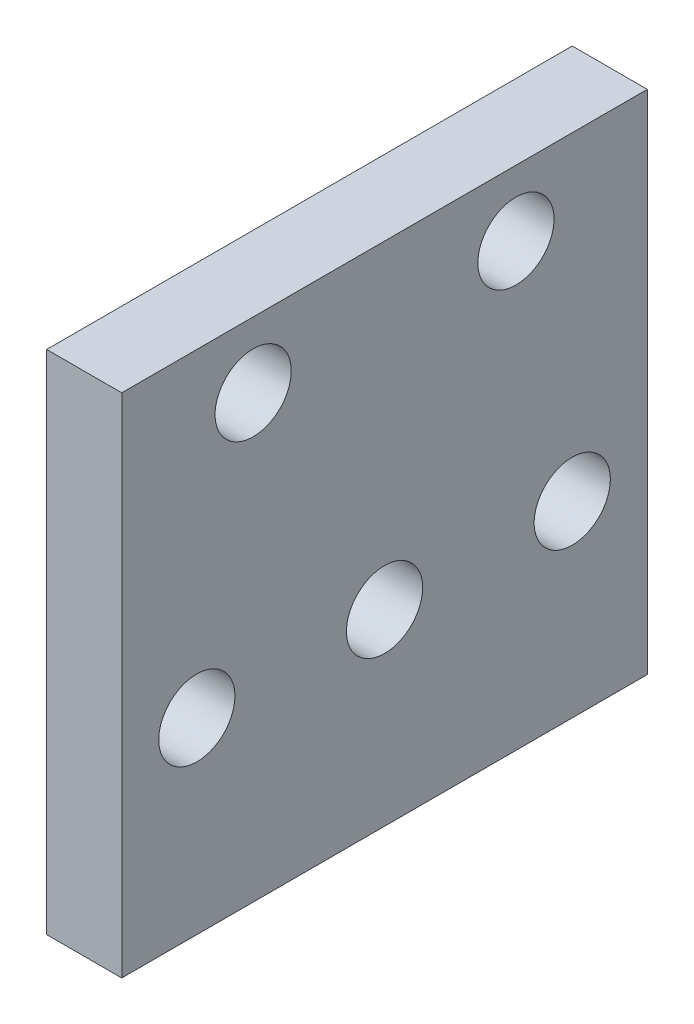
ISO-10303-21;
HEADER;
FILE_DESCRIPTION(('STEP AP214'),'2;1');
FILE_NAME('part.step','',(''),(''),'','','');
FILE_SCHEMA(('AUTOMOTIVE_DESIGN { 1 0 10303 214 1 1 1 1 }'));
ENDSEC;
DATA;
#1=APPLICATION_CONTEXT('core data for automotive mechanical design processes');
#2=APPLICATION_PROTOCOL_DEFINITION('international standard','automotive_design',2000,#1);
#3=PRODUCT_CONTEXT('',#1,'mechanical');
#4=PRODUCT('Part','Part','',(#3));
#5=PRODUCT_RELATED_PRODUCT_CATEGORY('part','',(#4));
#6=PRODUCT_DEFINITION_FORMATION('','',#4);
#7=PRODUCT_DEFINITION_CONTEXT('part definition',#1,'design');
#8=PRODUCT_DEFINITION('design','',#6,#7);
#9=PRODUCT_DEFINITION_SHAPE('','',#8);
#10=(LENGTH_UNIT() NAMED_UNIT(*) SI_UNIT(.MILLI.,.METRE.));
#11=(NAMED_UNIT(*) PLANE_ANGLE_UNIT() SI_UNIT($,.RADIAN.));
#12=(NAMED_UNIT(*) SI_UNIT($,.STERADIAN.) SOLID_ANGLE_UNIT());
#13=UNCERTAINTY_MEASURE_WITH_UNIT(LENGTH_MEASURE(1.E-05),#10,'distance_accuracy_value','');
#14=(GEOMETRIC_REPRESENTATION_CONTEXT(3) GLOBAL_UNCERTAINTY_ASSIGNED_CONTEXT((#13)) GLOBAL_UNIT_ASSIGNED_CONTEXT((#10,
#11,#12)) REPRESENTATION_CONTEXT('',''));
#15=CARTESIAN_POINT('',(0.,0.,0.));
#16=DIRECTION('',(0.,0.,1.));
#17=DIRECTION('',(1.,0.,0.));
#18=AXIS2_PLACEMENT_3D('',#15,#16,#17);
#19=CARTESIAN_POINT('',(5.08,-17.145,-17.78));
#20=DIRECTION('',(0.,0.,1.));
#21=DIRECTION('',(1.,0.,0.));
#22=AXIS2_PLACEMENT_3D('',#19,#20,#21);
#23=PLANE('',#22);
#24=DIRECTION('',(0.,1.,0.));
#25=VECTOR('',#24,1.);
#26=CARTESIAN_POINT('',(0.,-17.145,-17.78));
#27=LINE('',#26,#25);
#28=CARTESIAN_POINT('',(0.,-17.145,-17.78));
#29=VERTEX_POINT('',#28);
#30=CARTESIAN_POINT('',(0.,17.145,-17.78));
#31=VERTEX_POINT('',#30);
#32=EDGE_CURVE('E102',#29,#31,#27,.T.);
#33=ORIENTED_EDGE('',*,*,#32,.T.);
#34=DIRECTION('',(-1.,0.,0.));
#35=VECTOR('',#34,1.);
#36=CARTESIAN_POINT('',(5.08,17.145,-17.78));
#37=LINE('',#36,#35);
#38=CARTESIAN_POINT('',(5.08,17.145,-17.78));
#39=VERTEX_POINT('',#38);
#40=EDGE_CURVE('E11',#39,#31,#37,.T.);
#41=ORIENTED_EDGE('',*,*,#40,.F.);
#42=DIRECTION('',(0.,1.,0.));
#43=VECTOR('',#42,1.);
#44=CARTESIAN_POINT('',(5.08,-17.145,-17.78));
#45=LINE('',#44,#43);
#46=CARTESIAN_POINT('',(5.08,-17.145,-17.78));
#47=VERTEX_POINT('',#46);
#48=EDGE_CURVE('E90',#47,#39,#45,.T.);
#49=ORIENTED_EDGE('',*,*,#48,.F.);
#50=DIRECTION('',(-1.,0.,0.));
#51=VECTOR('',#50,1.);
#52=CARTESIAN_POINT('',(5.08,-17.145,-17.78));
#53=LINE('',#52,#51);
#54=EDGE_CURVE('E98',#47,#29,#53,.T.);
#55=ORIENTED_EDGE('',*,*,#54,.T.);
#56=EDGE_LOOP('',(#33,#41,#49,#55));
#57=FACE_BOUND('',#56,.T.);
#58=ADVANCED_FACE('F39',(#57),#23,.F.);
#59=CARTESIAN_POINT('',(5.08,17.145,17.78));
#60=DIRECTION('',(0.,-1.,0.));
#61=DIRECTION('',(0.,0.,-1.));
#62=AXIS2_PLACEMENT_3D('',#59,#60,#61);
#63=PLANE('',#62);
#64=DIRECTION('',(0.,0.,1.));
#65=VECTOR('',#64,1.);
#66=CARTESIAN_POINT('',(0.,17.145,17.78));
#67=LINE('',#66,#65);
#68=CARTESIAN_POINT('',(0.,17.145,17.78));
#69=VERTEX_POINT('',#68);
#70=EDGE_CURVE('E94',#31,#69,#67,.T.);
#71=ORIENTED_EDGE('',*,*,#70,.T.);
#72=DIRECTION('',(-1.,0.,0.));
#73=VECTOR('',#72,1.);
#74=CARTESIAN_POINT('',(5.08,17.145,17.78));
#75=LINE('',#74,#73);
#76=CARTESIAN_POINT('',(5.08,17.145,17.78));
#77=VERTEX_POINT('',#76);
#78=EDGE_CURVE('E47',#77,#69,#75,.T.);
#79=ORIENTED_EDGE('',*,*,#78,.F.);
#80=DIRECTION('',(0.,0.,1.));
#81=VECTOR('',#80,1.);
#82=CARTESIAN_POINT('',(5.08,17.145,17.78));
#83=LINE('',#82,#81);
#84=EDGE_CURVE('E85',#39,#77,#83,.T.);
#85=ORIENTED_EDGE('',*,*,#84,.F.);
#86=ORIENTED_EDGE('',*,*,#40,.T.);
#87=EDGE_LOOP('',(#71,#79,#85,#86));
#88=FACE_BOUND('',#87,.T.);
#89=ADVANCED_FACE('F93',(#88),#63,.F.);
#90=CARTESIAN_POINT('',(5.08,-17.145,17.78));
#91=DIRECTION('',(0.,0.,-1.));
#92=DIRECTION('',(-1.,0.,0.));
#93=AXIS2_PLACEMENT_3D('',#90,#91,#92);
#94=PLANE('',#93);
#95=DIRECTION('',(0.,-1.,0.));
#96=VECTOR('',#95,1.);
#97=CARTESIAN_POINT('',(0.,-17.145,17.78));
#98=LINE('',#97,#96);
#99=CARTESIAN_POINT('',(0.,-17.145,17.78));
#100=VERTEX_POINT('',#99);
#101=EDGE_CURVE('E72',#69,#100,#98,.T.);
#102=ORIENTED_EDGE('',*,*,#101,.T.);
#103=DIRECTION('',(-1.,0.,0.));
#104=VECTOR('',#103,1.);
#105=CARTESIAN_POINT('',(5.08,-17.145,17.78));
#106=LINE('',#105,#104);
#107=CARTESIAN_POINT('',(5.08,-17.145,17.78));
#108=VERTEX_POINT('',#107);
#109=EDGE_CURVE('E95',#108,#100,#106,.T.);
#110=ORIENTED_EDGE('',*,*,#109,.F.);
#111=DIRECTION('',(0.,-1.,0.));
#112=VECTOR('',#111,1.);
#113=CARTESIAN_POINT('',(5.08,-17.145,17.78));
#114=LINE('',#113,#112);
#115=EDGE_CURVE('E88',#77,#108,#114,.T.);
#116=ORIENTED_EDGE('',*,*,#115,.F.);
#117=ORIENTED_EDGE('',*,*,#78,.T.);
#118=EDGE_LOOP('',(#102,#110,#116,#117));
#119=FACE_BOUND('',#118,.T.);
#120=ADVANCED_FACE('F96',(#119),#94,.F.);
#121=CARTESIAN_POINT('',(5.08,-17.145,17.78));
#122=DIRECTION('',(0.,1.,0.));
#123=DIRECTION('',(0.,0.,1.));
#124=AXIS2_PLACEMENT_3D('',#121,#122,#123);
#125=PLANE('',#124);
#126=DIRECTION('',(0.,0.,-1.));
#127=VECTOR('',#126,1.);
#128=CARTESIAN_POINT('',(0.,-17.145,17.78));
#129=LINE('',#128,#127);
#130=EDGE_CURVE('E78',#100,#29,#129,.T.);
#131=ORIENTED_EDGE('',*,*,#130,.T.);
#132=ORIENTED_EDGE('',*,*,#54,.F.);
#133=DIRECTION('',(0.,0.,-1.));
#134=VECTOR('',#133,1.);
#135=CARTESIAN_POINT('',(5.08,-17.145,17.78));
#136=LINE('',#135,#134);
#137=EDGE_CURVE('E55',#108,#47,#136,.T.);
#138=ORIENTED_EDGE('',*,*,#137,.F.);
#139=ORIENTED_EDGE('',*,*,#109,.T.);
#140=EDGE_LOOP('',(#131,#132,#138,#139));
#141=FACE_BOUND('',#140,.T.);
#142=ADVANCED_FACE('F110',(#141),#125,.F.);
#143=CARTESIAN_POINT('',(5.08,0.,0.));
#144=DIRECTION('',(-1.,0.,0.));
#145=DIRECTION('',(0.,0.,1.));
#146=AXIS2_PLACEMENT_3D('',#143,#144,#145);
#147=PLANE('',#146);
#148=CARTESIAN_POINT('',(5.08,12.7,-8.89));
#149=DIRECTION('',(1.,0.,0.));
#150=DIRECTION('',(0.,0.,-1.));
#151=AXIS2_PLACEMENT_3D('',#148,#149,#150);
#152=CIRCLE('',#151,2.5781);
#153=CARTESIAN_POINT('',(5.08,12.7,-11.4681));
#154=VERTEX_POINT('',#153);
#155=EDGE_CURVE('E119',#154,#154,#152,.T.);
#156=ORIENTED_EDGE('',*,*,#155,.F.);
#157=EDGE_LOOP('',(#156));
#158=FACE_BOUND('',#157,.T.);
#159=CARTESIAN_POINT('',(5.08,-4.445,12.7));
#160=DIRECTION('',(1.,0.,0.));
#161=DIRECTION('',(0.,0.,-1.));
#162=AXIS2_PLACEMENT_3D('',#159,#160,#161);
#163=CIRCLE('',#162,2.5781);
#164=CARTESIAN_POINT('',(5.08,-4.445,10.1219));
#165=VERTEX_POINT('',#164);
#166=EDGE_CURVE('E125',#165,#165,#163,.T.);
#167=ORIENTED_EDGE('',*,*,#166,.F.);
#168=EDGE_LOOP('',(#167));
#169=FACE_BOUND('',#168,.T.);
#170=CARTESIAN_POINT('',(5.08,-4.445,0.));
#171=DIRECTION('',(1.,0.,0.));
#172=DIRECTION('',(0.,0.,-1.));
#173=AXIS2_PLACEMENT_3D('',#170,#171,#172);
#174=CIRCLE('',#173,2.5781);
#175=CARTESIAN_POINT('',(5.08,-4.445,-2.5781));
#176=VERTEX_POINT('',#175);
#177=EDGE_CURVE('E126',#176,#176,#174,.T.);
#178=ORIENTED_EDGE('',*,*,#177,.F.);
#179=EDGE_LOOP('',(#178));
#180=FACE_BOUND('',#179,.T.);
#181=CARTESIAN_POINT('',(5.08,-4.44499999999999,-12.7));
#182=DIRECTION('',(1.,0.,0.));
#183=DIRECTION('',(0.,0.,-1.));
#184=AXIS2_PLACEMENT_3D('',#181,#182,#183);
#185=CIRCLE('',#184,2.5781);
#186=CARTESIAN_POINT('',(5.08,-4.44499999999999,-15.2781));
#187=VERTEX_POINT('',#186);
#188=EDGE_CURVE('E137',#187,#187,#185,.T.);
#189=ORIENTED_EDGE('',*,*,#188,.F.);
#190=EDGE_LOOP('',(#189));
#191=FACE_BOUND('',#190,.T.);
#192=CARTESIAN_POINT('',(5.08,12.7,8.89));
#193=DIRECTION('',(1.,0.,0.));
#194=DIRECTION('',(0.,0.,-1.));
#195=AXIS2_PLACEMENT_3D('',#192,#193,#194);
#196=CIRCLE('',#195,2.5781);
#197=CARTESIAN_POINT('',(5.08,12.7,6.3119));
#198=VERTEX_POINT('',#197);
#199=EDGE_CURVE('E116',#198,#198,#196,.T.);
#200=ORIENTED_EDGE('',*,*,#199,.F.);
#201=EDGE_LOOP('',(#200));
#202=FACE_BOUND('',#201,.T.);
#203=ORIENTED_EDGE('',*,*,#48,.T.);
#204=ORIENTED_EDGE('',*,*,#84,.T.);
#205=ORIENTED_EDGE('',*,*,#115,.T.);
#206=ORIENTED_EDGE('',*,*,#137,.T.);
#207=EDGE_LOOP('',(#203,#204,#205,#206));
#208=FACE_BOUND('',#207,.T.);
#209=ADVANCED_FACE('F86',(#158,#169,#180,#191,#202,#208),#147,.F.);
#210=CARTESIAN_POINT('',(0.,0.,0.));
#211=DIRECTION('',(-1.,0.,0.));
#212=DIRECTION('',(0.,0.,1.));
#213=AXIS2_PLACEMENT_3D('',#210,#211,#212);
#214=PLANE('',#213);
#215=CARTESIAN_POINT('',(0.,12.7,-8.89));
#216=DIRECTION('',(1.,0.,0.));
#217=DIRECTION('',(0.,0.,-1.));
#218=AXIS2_PLACEMENT_3D('',#215,#216,#217);
#219=CIRCLE('',#218,2.5781);
#220=CARTESIAN_POINT('',(0.,12.7,-11.4681));
#221=VERTEX_POINT('',#220);
#222=EDGE_CURVE('E129',#221,#221,#219,.T.);
#223=ORIENTED_EDGE('',*,*,#222,.T.);
#224=EDGE_LOOP('',(#223));
#225=FACE_BOUND('',#224,.T.);
#226=CARTESIAN_POINT('',(0.,-4.445,12.7));
#227=DIRECTION('',(1.,0.,0.));
#228=DIRECTION('',(0.,0.,-1.));
#229=AXIS2_PLACEMENT_3D('',#226,#227,#228);
#230=CIRCLE('',#229,2.5781);
#231=CARTESIAN_POINT('',(0.,-4.445,10.1219));
#232=VERTEX_POINT('',#231);
#233=EDGE_CURVE('E122',#232,#232,#230,.T.);
#234=ORIENTED_EDGE('',*,*,#233,.T.);
#235=EDGE_LOOP('',(#234));
#236=FACE_BOUND('',#235,.T.);
#237=CARTESIAN_POINT('',(0.,-4.445,0.));
#238=DIRECTION('',(1.,0.,0.));
#239=DIRECTION('',(0.,0.,-1.));
#240=AXIS2_PLACEMENT_3D('',#237,#238,#239);
#241=CIRCLE('',#240,2.5781);
#242=CARTESIAN_POINT('',(0.,-4.445,-2.5781));
#243=VERTEX_POINT('',#242);
#244=EDGE_CURVE('E140',#243,#243,#241,.T.);
#245=ORIENTED_EDGE('',*,*,#244,.T.);
#246=EDGE_LOOP('',(#245));
#247=FACE_BOUND('',#246,.T.);
#248=CARTESIAN_POINT('',(0.,-4.44499999999999,-12.7));
#249=DIRECTION('',(1.,0.,0.));
#250=DIRECTION('',(0.,0.,-1.));
#251=AXIS2_PLACEMENT_3D('',#248,#249,#250);
#252=CIRCLE('',#251,2.5781);
#253=CARTESIAN_POINT('',(0.,-4.44499999999999,-15.2781));
#254=VERTEX_POINT('',#253);
#255=EDGE_CURVE('E134',#254,#254,#252,.T.);
#256=ORIENTED_EDGE('',*,*,#255,.T.);
#257=EDGE_LOOP('',(#256));
#258=FACE_BOUND('',#257,.T.);
#259=CARTESIAN_POINT('',(0.,12.7,8.89));
#260=DIRECTION('',(1.,0.,0.));
#261=DIRECTION('',(0.,0.,-1.));
#262=AXIS2_PLACEMENT_3D('',#259,#260,#261);
#263=CIRCLE('',#262,2.5781);
#264=CARTESIAN_POINT('',(0.,12.7,6.3119));
#265=VERTEX_POINT('',#264);
#266=EDGE_CURVE('E105',#265,#265,#263,.T.);
#267=ORIENTED_EDGE('',*,*,#266,.T.);
#268=EDGE_LOOP('',(#267));
#269=FACE_BOUND('',#268,.T.);
#270=ORIENTED_EDGE('',*,*,#32,.F.);
#271=ORIENTED_EDGE('',*,*,#130,.F.);
#272=ORIENTED_EDGE('',*,*,#101,.F.);
#273=ORIENTED_EDGE('',*,*,#70,.F.);
#274=EDGE_LOOP('',(#270,#271,#272,#273));
#275=FACE_BOUND('',#274,.T.);
#276=ADVANCED_FACE('F113',(#225,#236,#247,#258,#269,#275),#214,.T.);
#277=CARTESIAN_POINT('',(0.,12.7,8.89));
#278=DIRECTION('',(1.,0.,0.));
#279=DIRECTION('',(0.,0.,-1.));
#280=AXIS2_PLACEMENT_3D('',#277,#278,#279);
#281=CYLINDRICAL_SURFACE('',#280,2.5781);
#282=ORIENTED_EDGE('',*,*,#266,.F.);
#283=EDGE_LOOP('',(#282));
#284=FACE_BOUND('',#283,.T.);
#285=ORIENTED_EDGE('',*,*,#199,.T.);
#286=EDGE_LOOP('',(#285));
#287=FACE_BOUND('',#286,.T.);
#288=ADVANCED_FACE('F156',(#284,#287),#281,.F.);
#289=CARTESIAN_POINT('',(0.,-4.44499999999999,-12.7));
#290=DIRECTION('',(1.,0.,0.));
#291=DIRECTION('',(0.,0.,-1.));
#292=AXIS2_PLACEMENT_3D('',#289,#290,#291);
#293=CYLINDRICAL_SURFACE('',#292,2.5781);
#294=ORIENTED_EDGE('',*,*,#255,.F.);
#295=EDGE_LOOP('',(#294));
#296=FACE_BOUND('',#295,.T.);
#297=ORIENTED_EDGE('',*,*,#188,.T.);
#298=EDGE_LOOP('',(#297));
#299=FACE_BOUND('',#298,.T.);
#300=ADVANCED_FACE('F158',(#296,#299),#293,.F.);
#301=CARTESIAN_POINT('',(0.,-4.445,0.));
#302=DIRECTION('',(1.,0.,0.));
#303=DIRECTION('',(0.,0.,-1.));
#304=AXIS2_PLACEMENT_3D('',#301,#302,#303);
#305=CYLINDRICAL_SURFACE('',#304,2.5781);
#306=ORIENTED_EDGE('',*,*,#244,.F.);
#307=EDGE_LOOP('',(#306));
#308=FACE_BOUND('',#307,.T.);
#309=ORIENTED_EDGE('',*,*,#177,.T.);
#310=EDGE_LOOP('',(#309));
#311=FACE_BOUND('',#310,.T.);
#312=ADVANCED_FACE('F146',(#308,#311),#305,.F.);
#313=CARTESIAN_POINT('',(0.,-4.445,12.7));
#314=DIRECTION('',(1.,0.,0.));
#315=DIRECTION('',(0.,0.,-1.));
#316=AXIS2_PLACEMENT_3D('',#313,#314,#315);
#317=CYLINDRICAL_SURFACE('',#316,2.5781);
#318=ORIENTED_EDGE('',*,*,#233,.F.);
#319=EDGE_LOOP('',(#318));
#320=FACE_BOUND('',#319,.T.);
#321=ORIENTED_EDGE('',*,*,#166,.T.);
#322=EDGE_LOOP('',(#321));
#323=FACE_BOUND('',#322,.T.);
#324=ADVANCED_FACE('F215',(#320,#323),#317,.F.);
#325=CARTESIAN_POINT('',(0.,12.7,-8.89));
#326=DIRECTION('',(1.,0.,0.));
#327=DIRECTION('',(0.,0.,-1.));
#328=AXIS2_PLACEMENT_3D('',#325,#326,#327);
#329=CYLINDRICAL_SURFACE('',#328,2.5781);
#330=ORIENTED_EDGE('',*,*,#222,.F.);
#331=EDGE_LOOP('',(#330));
#332=FACE_BOUND('',#331,.T.);
#333=ORIENTED_EDGE('',*,*,#155,.T.);
#334=EDGE_LOOP('',(#333));
#335=FACE_BOUND('',#334,.T.);
#336=ADVANCED_FACE('F225',(#332,#335),#329,.F.);
#337=CLOSED_SHELL('',(#58,#89,#120,#142,#209,#276,#288,#300,#312,#324,#336));
#338=MANIFOLD_SOLID_BREP('B2',#337);
#339=ADVANCED_BREP_SHAPE_REPRESENTATION('',(#18,#338),#14);
#340=SHAPE_DEFINITION_REPRESENTATION(#9,#339);
ENDSEC;
END-ISO-10303-21;
